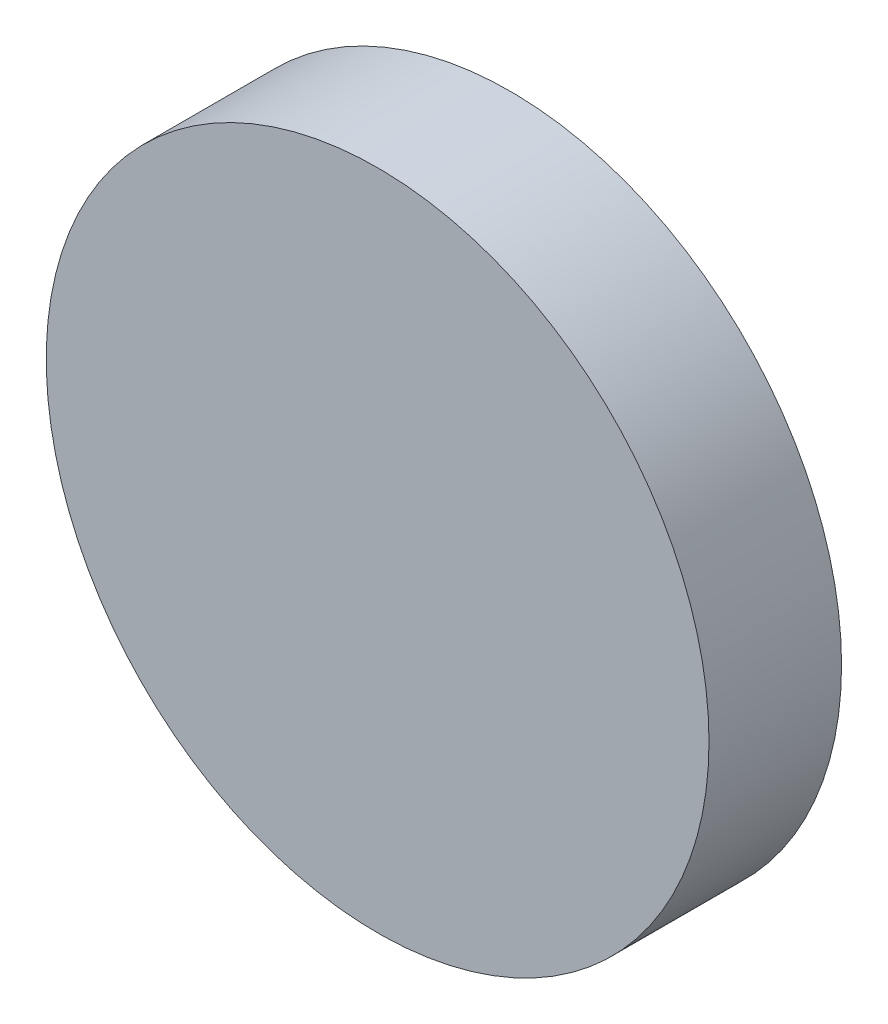
ISO-10303-21;
HEADER;
FILE_DESCRIPTION(('STEP AP214'),'2;1');
FILE_NAME('part.step','',(''),(''),'','','');
FILE_SCHEMA(('AUTOMOTIVE_DESIGN { 1 0 10303 214 1 1 1 1 }'));
ENDSEC;
DATA;
#1=APPLICATION_CONTEXT('core data for automotive mechanical design processes');
#2=APPLICATION_PROTOCOL_DEFINITION('international standard','automotive_design',2000,#1);
#3=PRODUCT_CONTEXT('',#1,'mechanical');
#4=PRODUCT('Part','Part','',(#3));
#5=PRODUCT_RELATED_PRODUCT_CATEGORY('part','',(#4));
#6=PRODUCT_DEFINITION_FORMATION('','',#4);
#7=PRODUCT_DEFINITION_CONTEXT('part definition',#1,'design');
#8=PRODUCT_DEFINITION('design','',#6,#7);
#9=PRODUCT_DEFINITION_SHAPE('','',#8);
#10=(LENGTH_UNIT() NAMED_UNIT(*) SI_UNIT(.MILLI.,.METRE.));
#11=(NAMED_UNIT(*) PLANE_ANGLE_UNIT() SI_UNIT($,.RADIAN.));
#12=(NAMED_UNIT(*) SI_UNIT($,.STERADIAN.) SOLID_ANGLE_UNIT());
#13=UNCERTAINTY_MEASURE_WITH_UNIT(LENGTH_MEASURE(1.E-05),#10,'distance_accuracy_value','');
#14=(GEOMETRIC_REPRESENTATION_CONTEXT(3) GLOBAL_UNCERTAINTY_ASSIGNED_CONTEXT((#13)) GLOBAL_UNIT_ASSIGNED_CONTEXT((#10,
#11,#12)) REPRESENTATION_CONTEXT('',''));
#15=CARTESIAN_POINT('',(0.,0.,0.));
#16=DIRECTION('',(0.,0.,1.));
#17=DIRECTION('',(1.,0.,0.));
#18=AXIS2_PLACEMENT_3D('',#15,#16,#17);
#19=CARTESIAN_POINT('',(0.,0.,5.));
#20=DIRECTION('',(0.,0.,-1.));
#21=DIRECTION('',(-1.,0.,0.));
#22=AXIS2_PLACEMENT_3D('',#19,#20,#21);
#23=CYLINDRICAL_SURFACE('',#22,12.5);
#24=CARTESIAN_POINT('',(0.,0.,5.));
#25=DIRECTION('',(0.,0.,1.));
#26=DIRECTION('',(1.,0.,0.));
#27=AXIS2_PLACEMENT_3D('',#24,#25,#26);
#28=CIRCLE('',#27,12.5);
#29=CARTESIAN_POINT('',(12.5,0.,5.));
#30=VERTEX_POINT('',#29);
#31=EDGE_CURVE('E10',#30,#30,#28,.T.);
#32=ORIENTED_EDGE('',*,*,#31,.F.);
#33=EDGE_LOOP('',(#32));
#34=FACE_BOUND('',#33,.T.);
#35=CARTESIAN_POINT('',(0.,0.,0.));
#36=DIRECTION('',(0.,0.,1.));
#37=DIRECTION('',(1.,0.,0.));
#38=AXIS2_PLACEMENT_3D('',#35,#36,#37);
#39=CIRCLE('',#38,12.5);
#40=CARTESIAN_POINT('',(12.5,0.,0.));
#41=VERTEX_POINT('',#40);
#42=EDGE_CURVE('E37',#41,#41,#39,.T.);
#43=ORIENTED_EDGE('',*,*,#42,.T.);
#44=EDGE_LOOP('',(#43));
#45=FACE_BOUND('',#44,.T.);
#46=ADVANCED_FACE('F34',(#34,#45),#23,.T.);
#47=CARTESIAN_POINT('',(0.,0.,5.));
#48=DIRECTION('',(0.,0.,1.));
#49=DIRECTION('',(1.,0.,0.));
#50=AXIS2_PLACEMENT_3D('',#47,#48,#49);
#51=PLANE('',#50);
#52=ORIENTED_EDGE('',*,*,#31,.T.);
#53=EDGE_LOOP('',(#52));
#54=FACE_BOUND('',#53,.T.);
#55=ADVANCED_FACE('F49',(#54),#51,.T.);
#56=CARTESIAN_POINT('',(0.,0.,0.));
#57=DIRECTION('',(0.,0.,1.));
#58=DIRECTION('',(1.,0.,0.));
#59=AXIS2_PLACEMENT_3D('',#56,#57,#58);
#60=PLANE('',#59);
#61=ORIENTED_EDGE('',*,*,#42,.F.);
#62=EDGE_LOOP('',(#61));
#63=FACE_BOUND('',#62,.T.);
#64=ADVANCED_FACE('F47',(#63),#60,.F.);
#65=CLOSED_SHELL('',(#46,#55,#64));
#66=MANIFOLD_SOLID_BREP('B2',#65);
#67=ADVANCED_BREP_SHAPE_REPRESENTATION('',(#18,#66),#14);
#68=SHAPE_DEFINITION_REPRESENTATION(#9,#67);
ENDSEC;
END-ISO-10303-21;
